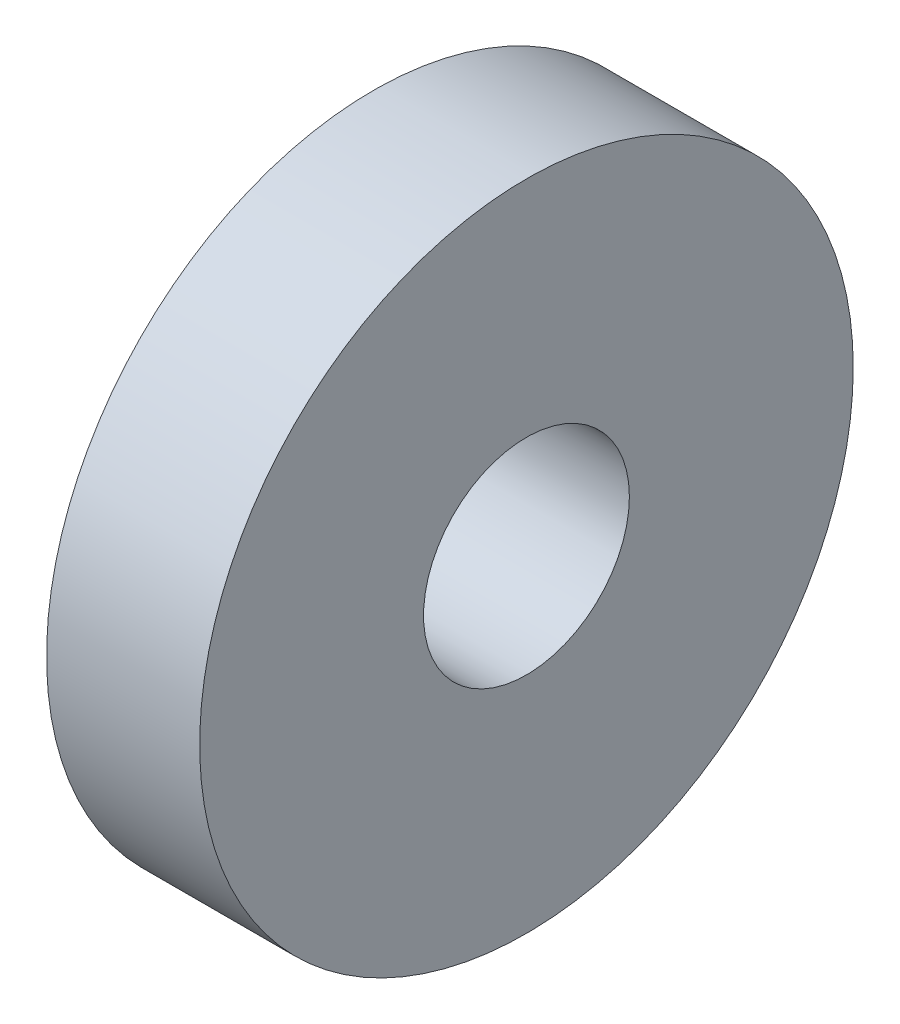
ISO-10303-21;
HEADER;
FILE_DESCRIPTION(('STEP AP214'),'2;1');
FILE_NAME('part.step','',(''),(''),'','','');
FILE_SCHEMA(('AUTOMOTIVE_DESIGN { 1 0 10303 214 1 1 1 1 }'));
ENDSEC;
DATA;
#1=APPLICATION_CONTEXT('core data for automotive mechanical design processes');
#2=APPLICATION_PROTOCOL_DEFINITION('international standard','automotive_design',2000,#1);
#3=PRODUCT_CONTEXT('',#1,'mechanical');
#4=PRODUCT('Part','Part','',(#3));
#5=PRODUCT_RELATED_PRODUCT_CATEGORY('part','',(#4));
#6=PRODUCT_DEFINITION_FORMATION('','',#4);
#7=PRODUCT_DEFINITION_CONTEXT('part definition',#1,'design');
#8=PRODUCT_DEFINITION('design','',#6,#7);
#9=PRODUCT_DEFINITION_SHAPE('','',#8);
#10=(LENGTH_UNIT() NAMED_UNIT(*) SI_UNIT(.MILLI.,.METRE.));
#11=(NAMED_UNIT(*) PLANE_ANGLE_UNIT() SI_UNIT($,.RADIAN.));
#12=(NAMED_UNIT(*) SI_UNIT($,.STERADIAN.) SOLID_ANGLE_UNIT());
#13=UNCERTAINTY_MEASURE_WITH_UNIT(LENGTH_MEASURE(1.E-05),#10,'distance_accuracy_value','');
#14=(GEOMETRIC_REPRESENTATION_CONTEXT(3) GLOBAL_UNCERTAINTY_ASSIGNED_CONTEXT((#13)) GLOBAL_UNIT_ASSIGNED_CONTEXT((#10,
#11,#12)) REPRESENTATION_CONTEXT('',''));
#15=CARTESIAN_POINT('',(0.,0.,0.));
#16=DIRECTION('',(0.,0.,1.));
#17=DIRECTION('',(1.,0.,0.));
#18=AXIS2_PLACEMENT_3D('',#15,#16,#17);
#19=CARTESIAN_POINT('',(2.975,0.,0.));
#20=DIRECTION('',(1.,0.,0.));
#21=DIRECTION('',(0.,0.,-1.));
#22=AXIS2_PLACEMENT_3D('',#19,#20,#21);
#23=PLANE('',#22);
#24=CARTESIAN_POINT('',(2.975,0.,0.));
#25=DIRECTION('',(1.,0.,0.));
#26=DIRECTION('',(0.,0.,-1.));
#27=AXIS2_PLACEMENT_3D('',#24,#25,#26);
#28=CIRCLE('',#27,6.35);
#29=CARTESIAN_POINT('',(2.975,0.,-6.35));
#30=VERTEX_POINT('',#29);
#31=EDGE_CURVE('E10',#30,#30,#28,.T.);
#32=ORIENTED_EDGE('',*,*,#31,.T.);
#33=EDGE_LOOP('',(#32));
#34=FACE_BOUND('',#33,.T.);
#35=CARTESIAN_POINT('',(2.975,0.,0.));
#36=DIRECTION('',(1.,0.,0.));
#37=DIRECTION('',(0.,0.,-1.));
#38=AXIS2_PLACEMENT_3D('',#35,#36,#37);
#39=CIRCLE('',#38,2.);
#40=CARTESIAN_POINT('',(2.975,0.,-2.));
#41=VERTEX_POINT('',#40);
#42=EDGE_CURVE('E53',#41,#41,#39,.T.);
#43=ORIENTED_EDGE('',*,*,#42,.F.);
#44=EDGE_LOOP('',(#43));
#45=FACE_BOUND('',#44,.T.);
#46=ADVANCED_FACE('F40',(#34,#45),#23,.T.);
#47=CARTESIAN_POINT('',(0.,0.,0.));
#48=DIRECTION('',(1.,0.,0.));
#49=DIRECTION('',(0.,0.,-1.));
#50=AXIS2_PLACEMENT_3D('',#47,#48,#49);
#51=PLANE('',#50);
#52=CARTESIAN_POINT('',(0.,0.,0.));
#53=DIRECTION('',(1.,0.,0.));
#54=DIRECTION('',(0.,0.,-1.));
#55=AXIS2_PLACEMENT_3D('',#52,#53,#54);
#56=CIRCLE('',#55,6.35);
#57=CARTESIAN_POINT('',(0.,0.,-6.35));
#58=VERTEX_POINT('',#57);
#59=EDGE_CURVE('E44',#58,#58,#56,.T.);
#60=ORIENTED_EDGE('',*,*,#59,.F.);
#61=EDGE_LOOP('',(#60));
#62=FACE_BOUND('',#61,.T.);
#63=CARTESIAN_POINT('',(0.,0.,0.));
#64=DIRECTION('',(1.,0.,0.));
#65=DIRECTION('',(0.,0.,-1.));
#66=AXIS2_PLACEMENT_3D('',#63,#64,#65);
#67=CIRCLE('',#66,2.);
#68=CARTESIAN_POINT('',(0.,0.,-2.));
#69=VERTEX_POINT('',#68);
#70=EDGE_CURVE('E55',#69,#69,#67,.T.);
#71=ORIENTED_EDGE('',*,*,#70,.T.);
#72=EDGE_LOOP('',(#71));
#73=FACE_BOUND('',#72,.T.);
#74=ADVANCED_FACE('F67',(#62,#73),#51,.F.);
#75=CARTESIAN_POINT('',(2.975,0.,0.));
#76=DIRECTION('',(-1.,0.,0.));
#77=DIRECTION('',(0.,0.,1.));
#78=AXIS2_PLACEMENT_3D('',#75,#76,#77);
#79=CYLINDRICAL_SURFACE('',#78,6.35);
#80=ORIENTED_EDGE('',*,*,#31,.F.);
#81=EDGE_LOOP('',(#80));
#82=FACE_BOUND('',#81,.T.);
#83=ORIENTED_EDGE('',*,*,#59,.T.);
#84=EDGE_LOOP('',(#83));
#85=FACE_BOUND('',#84,.T.);
#86=ADVANCED_FACE('F42',(#82,#85),#79,.T.);
#87=CARTESIAN_POINT('',(2.975,0.,0.));
#88=DIRECTION('',(-1.,0.,0.));
#89=DIRECTION('',(0.,0.,1.));
#90=AXIS2_PLACEMENT_3D('',#87,#88,#89);
#91=CYLINDRICAL_SURFACE('',#90,2.);
#92=ORIENTED_EDGE('',*,*,#42,.T.);
#93=EDGE_LOOP('',(#92));
#94=FACE_BOUND('',#93,.T.);
#95=ORIENTED_EDGE('',*,*,#70,.F.);
#96=EDGE_LOOP('',(#95));
#97=FACE_BOUND('',#96,.T.);
#98=ADVANCED_FACE('F63',(#94,#97),#91,.F.);
#99=CLOSED_SHELL('',(#46,#74,#86,#98));
#100=MANIFOLD_SOLID_BREP('B2',#99);
#101=ADVANCED_BREP_SHAPE_REPRESENTATION('',(#18,#100),#14);
#102=SHAPE_DEFINITION_REPRESENTATION(#9,#101);
ENDSEC;
END-ISO-10303-21;
